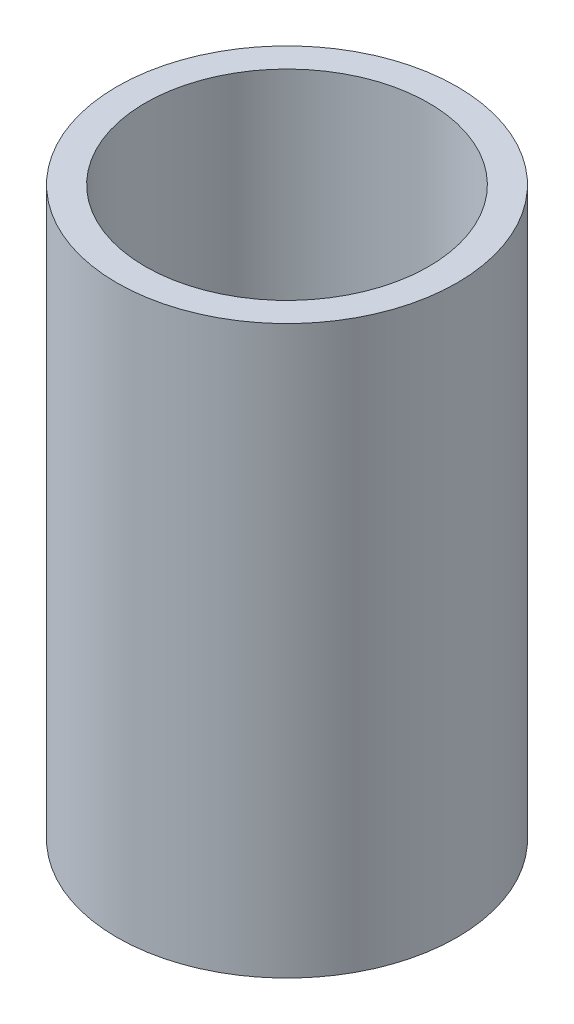
ISO-10303-21;
HEADER;
FILE_DESCRIPTION(('STEP AP214'),'2;1');
FILE_NAME('part.step','',(''),(''),'','','');
FILE_SCHEMA(('AUTOMOTIVE_DESIGN { 1 0 10303 214 1 1 1 1 }'));
ENDSEC;
DATA;
#1=APPLICATION_CONTEXT('core data for automotive mechanical design processes');
#2=APPLICATION_PROTOCOL_DEFINITION('international standard','automotive_design',2000,#1);
#3=PRODUCT_CONTEXT('',#1,'mechanical');
#4=PRODUCT('Part','Part','',(#3));
#5=PRODUCT_RELATED_PRODUCT_CATEGORY('part','',(#4));
#6=PRODUCT_DEFINITION_FORMATION('','',#4);
#7=PRODUCT_DEFINITION_CONTEXT('part definition',#1,'design');
#8=PRODUCT_DEFINITION('design','',#6,#7);
#9=PRODUCT_DEFINITION_SHAPE('','',#8);
#10=(LENGTH_UNIT() NAMED_UNIT(*) SI_UNIT(.MILLI.,.METRE.));
#11=(NAMED_UNIT(*) PLANE_ANGLE_UNIT() SI_UNIT($,.RADIAN.));
#12=(NAMED_UNIT(*) SI_UNIT($,.STERADIAN.) SOLID_ANGLE_UNIT());
#13=UNCERTAINTY_MEASURE_WITH_UNIT(LENGTH_MEASURE(1.E-05),#10,'distance_accuracy_value','');
#14=(GEOMETRIC_REPRESENTATION_CONTEXT(3) GLOBAL_UNCERTAINTY_ASSIGNED_CONTEXT((#13)) GLOBAL_UNIT_ASSIGNED_CONTEXT((#10,
#11,#12)) REPRESENTATION_CONTEXT('',''));
#15=CARTESIAN_POINT('',(0.,0.,0.));
#16=DIRECTION('',(0.,0.,1.));
#17=DIRECTION('',(1.,0.,0.));
#18=AXIS2_PLACEMENT_3D('',#15,#16,#17);
#19=CARTESIAN_POINT('',(0.,50.,0.));
#20=DIRECTION('',(0.,1.,0.));
#21=DIRECTION('',(0.,0.,1.));
#22=AXIS2_PLACEMENT_3D('',#19,#20,#21);
#23=PLANE('',#22);
#24=CARTESIAN_POINT('',(0.,50.,0.));
#25=DIRECTION('',(0.,1.,0.));
#26=DIRECTION('',(0.,0.,1.));
#27=AXIS2_PLACEMENT_3D('',#24,#25,#26);
#28=CIRCLE('',#27,15.);
#29=CARTESIAN_POINT('',(0.,50.,15.));
#30=VERTEX_POINT('',#29);
#31=EDGE_CURVE('E10',#30,#30,#28,.T.);
#32=ORIENTED_EDGE('',*,*,#31,.T.);
#33=EDGE_LOOP('',(#32));
#34=FACE_BOUND('',#33,.T.);
#35=CARTESIAN_POINT('',(0.,50.,0.));
#36=DIRECTION('',(0.,1.,0.));
#37=DIRECTION('',(0.,0.,1.));
#38=AXIS2_PLACEMENT_3D('',#35,#36,#37);
#39=CIRCLE('',#38,12.5);
#40=CARTESIAN_POINT('',(0.,50.,12.5));
#41=VERTEX_POINT('',#40);
#42=EDGE_CURVE('E40',#41,#41,#39,.T.);
#43=ORIENTED_EDGE('',*,*,#42,.F.);
#44=EDGE_LOOP('',(#43));
#45=FACE_BOUND('',#44,.T.);
#46=ADVANCED_FACE('F29',(#34,#45),#23,.T.);
#47=CARTESIAN_POINT('',(0.,0.,0.));
#48=DIRECTION('',(0.,1.,0.));
#49=DIRECTION('',(0.,0.,1.));
#50=AXIS2_PLACEMENT_3D('',#47,#48,#49);
#51=PLANE('',#50);
#52=CARTESIAN_POINT('',(0.,0.,0.));
#53=DIRECTION('',(0.,1.,0.));
#54=DIRECTION('',(0.,0.,1.));
#55=AXIS2_PLACEMENT_3D('',#52,#53,#54);
#56=CIRCLE('',#55,15.);
#57=CARTESIAN_POINT('',(0.,0.,15.));
#58=VERTEX_POINT('',#57);
#59=EDGE_CURVE('E33',#58,#58,#56,.T.);
#60=ORIENTED_EDGE('',*,*,#59,.F.);
#61=EDGE_LOOP('',(#60));
#62=FACE_BOUND('',#61,.T.);
#63=CARTESIAN_POINT('',(0.,0.,0.));
#64=DIRECTION('',(0.,1.,0.));
#65=DIRECTION('',(0.,0.,1.));
#66=AXIS2_PLACEMENT_3D('',#63,#64,#65);
#67=CIRCLE('',#66,12.5);
#68=CARTESIAN_POINT('',(0.,0.,12.5));
#69=VERTEX_POINT('',#68);
#70=EDGE_CURVE('E42',#69,#69,#67,.T.);
#71=ORIENTED_EDGE('',*,*,#70,.T.);
#72=EDGE_LOOP('',(#71));
#73=FACE_BOUND('',#72,.T.);
#74=ADVANCED_FACE('F52',(#62,#73),#51,.F.);
#75=CARTESIAN_POINT('',(0.,50.,0.));
#76=DIRECTION('',(0.,-1.,0.));
#77=DIRECTION('',(0.,0.,-1.));
#78=AXIS2_PLACEMENT_3D('',#75,#76,#77);
#79=CYLINDRICAL_SURFACE('',#78,15.);
#80=ORIENTED_EDGE('',*,*,#31,.F.);
#81=EDGE_LOOP('',(#80));
#82=FACE_BOUND('',#81,.T.);
#83=ORIENTED_EDGE('',*,*,#59,.T.);
#84=EDGE_LOOP('',(#83));
#85=FACE_BOUND('',#84,.T.);
#86=ADVANCED_FACE('F31',(#82,#85),#79,.T.);
#87=CARTESIAN_POINT('',(0.,50.,0.));
#88=DIRECTION('',(0.,-1.,0.));
#89=DIRECTION('',(0.,0.,-1.));
#90=AXIS2_PLACEMENT_3D('',#87,#88,#89);
#91=CYLINDRICAL_SURFACE('',#90,12.5);
#92=ORIENTED_EDGE('',*,*,#42,.T.);
#93=EDGE_LOOP('',(#92));
#94=FACE_BOUND('',#93,.T.);
#95=ORIENTED_EDGE('',*,*,#70,.F.);
#96=EDGE_LOOP('',(#95));
#97=FACE_BOUND('',#96,.T.);
#98=ADVANCED_FACE('F48',(#94,#97),#91,.F.);
#99=CLOSED_SHELL('',(#46,#74,#86,#98));
#100=MANIFOLD_SOLID_BREP('B2',#99);
#101=ADVANCED_BREP_SHAPE_REPRESENTATION('',(#18,#100),#14);
#102=SHAPE_DEFINITION_REPRESENTATION(#9,#101);
ENDSEC;
END-ISO-10303-21;
